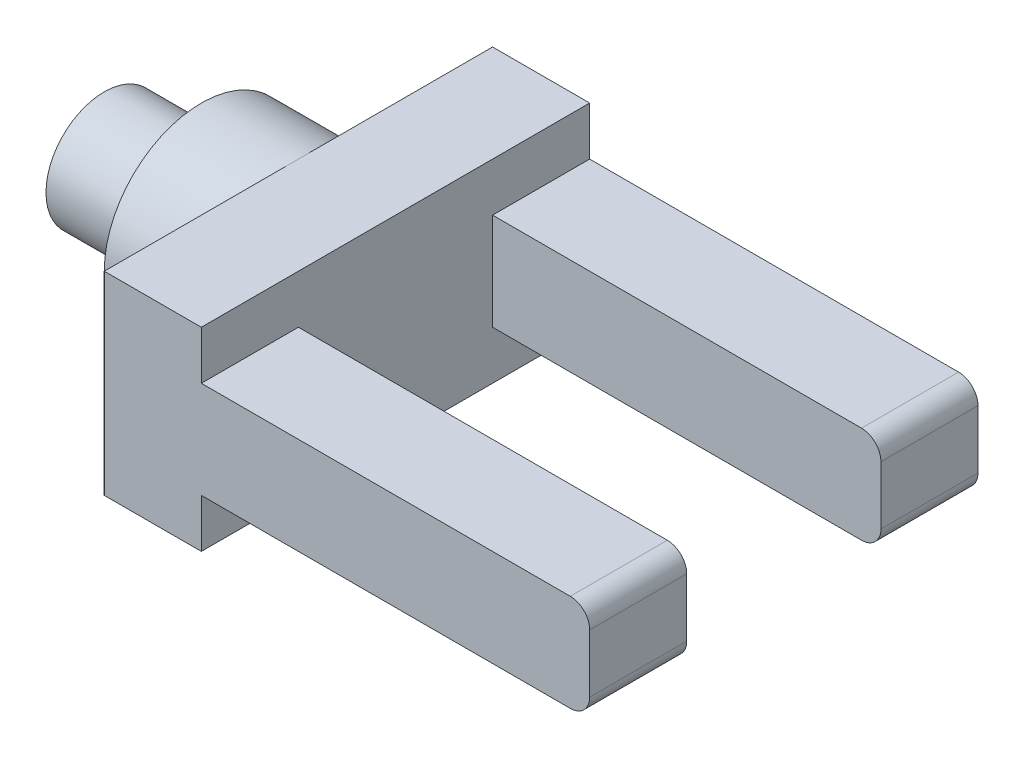
ISO-10303-21;
HEADER;
FILE_DESCRIPTION(('STEP AP214'),'2;1');
FILE_NAME('part.step','',(''),(''),'','','');
FILE_SCHEMA(('AUTOMOTIVE_DESIGN { 1 0 10303 214 1 1 1 1 }'));
ENDSEC;
DATA;
#1=APPLICATION_CONTEXT('core data for automotive mechanical design processes');
#2=APPLICATION_PROTOCOL_DEFINITION('international standard','automotive_design',2000,#1);
#3=PRODUCT_CONTEXT('',#1,'mechanical');
#4=PRODUCT('Part','Part','',(#3));
#5=PRODUCT_RELATED_PRODUCT_CATEGORY('part','',(#4));
#6=PRODUCT_DEFINITION_FORMATION('','',#4);
#7=PRODUCT_DEFINITION_CONTEXT('part definition',#1,'design');
#8=PRODUCT_DEFINITION('design','',#6,#7);
#9=PRODUCT_DEFINITION_SHAPE('','',#8);
#10=(LENGTH_UNIT() NAMED_UNIT(*) SI_UNIT(.MILLI.,.METRE.));
#11=(NAMED_UNIT(*) PLANE_ANGLE_UNIT() SI_UNIT($,.RADIAN.));
#12=(NAMED_UNIT(*) SI_UNIT($,.STERADIAN.) SOLID_ANGLE_UNIT());
#13=UNCERTAINTY_MEASURE_WITH_UNIT(LENGTH_MEASURE(1.E-05),#10,'distance_accuracy_value','');
#14=(GEOMETRIC_REPRESENTATION_CONTEXT(3) GLOBAL_UNCERTAINTY_ASSIGNED_CONTEXT((#13)) GLOBAL_UNIT_ASSIGNED_CONTEXT((#10,
#11,#12)) REPRESENTATION_CONTEXT('',''));
#15=CARTESIAN_POINT('',(0.,0.,0.));
#16=DIRECTION('',(0.,0.,1.));
#17=DIRECTION('',(1.,0.,0.));
#18=AXIS2_PLACEMENT_3D('',#15,#16,#17);
#19=CARTESIAN_POINT('',(30.,-10.,20.));
#20=DIRECTION('',(1.,0.,0.));
#21=DIRECTION('',(0.,0.,-1.));
#22=AXIS2_PLACEMENT_3D('',#19,#20,#21);
#23=PLANE('',#22);
#24=DIRECTION('',(0.,-1.,0.));
#25=VECTOR('',#24,1.);
#26=CARTESIAN_POINT('',(30.,5.,-10.));
#27=LINE('',#26,#25);
#28=CARTESIAN_POINT('',(30.,5.,-10.));
#29=VERTEX_POINT('',#28);
#30=CARTESIAN_POINT('',(30.,-5.,-10.));
#31=VERTEX_POINT('',#30);
#32=EDGE_CURVE('E178',#29,#31,#27,.T.);
#33=ORIENTED_EDGE('',*,*,#32,.F.);
#34=DIRECTION('',(0.,0.,1.));
#35=VECTOR('',#34,1.);
#36=CARTESIAN_POINT('',(30.,5.,-20.));
#37=LINE('',#36,#35);
#38=CARTESIAN_POINT('',(30.,5.,-20.));
#39=VERTEX_POINT('',#38);
#40=EDGE_CURVE('E156',#39,#29,#37,.T.);
#41=ORIENTED_EDGE('',*,*,#40,.F.);
#42=DIRECTION('',(0.,1.,0.));
#43=VECTOR('',#42,1.);
#44=CARTESIAN_POINT('',(30.,10.,-20.));
#45=LINE('',#44,#43);
#46=CARTESIAN_POINT('',(30.,10.,-20.));
#47=VERTEX_POINT('',#46);
#48=EDGE_CURVE('E165',#39,#47,#45,.T.);
#49=ORIENTED_EDGE('',*,*,#48,.T.);
#50=DIRECTION('',(0.,0.,1.));
#51=VECTOR('',#50,1.);
#52=CARTESIAN_POINT('',(30.,10.,20.));
#53=LINE('',#52,#51);
#54=CARTESIAN_POINT('',(30.,10.,20.));
#55=VERTEX_POINT('',#54);
#56=EDGE_CURVE('E288',#47,#55,#53,.T.);
#57=ORIENTED_EDGE('',*,*,#56,.T.);
#58=DIRECTION('',(0.,-1.,0.));
#59=VECTOR('',#58,1.);
#60=CARTESIAN_POINT('',(30.,10.,20.));
#61=LINE('',#60,#59);
#62=CARTESIAN_POINT('',(30.,5.,20.));
#63=VERTEX_POINT('',#62);
#64=EDGE_CURVE('E262',#55,#63,#61,.T.);
#65=ORIENTED_EDGE('',*,*,#64,.T.);
#66=DIRECTION('',(0.,0.,1.));
#67=VECTOR('',#66,1.);
#68=CARTESIAN_POINT('',(30.,5.,20.));
#69=LINE('',#68,#67);
#70=CARTESIAN_POINT('',(30.,5.,10.));
#71=VERTEX_POINT('',#70);
#72=EDGE_CURVE('E198',#71,#63,#69,.T.);
#73=ORIENTED_EDGE('',*,*,#72,.F.);
#74=DIRECTION('',(0.,1.,0.));
#75=VECTOR('',#74,1.);
#76=CARTESIAN_POINT('',(30.,5.,10.));
#77=LINE('',#76,#75);
#78=CARTESIAN_POINT('',(30.,-5.,10.));
#79=VERTEX_POINT('',#78);
#80=EDGE_CURVE('E202',#79,#71,#77,.T.);
#81=ORIENTED_EDGE('',*,*,#80,.F.);
#82=DIRECTION('',(0.,0.,-1.));
#83=VECTOR('',#82,1.);
#84=CARTESIAN_POINT('',(30.,-5.,20.));
#85=LINE('',#84,#83);
#86=CARTESIAN_POINT('',(30.,-5.,20.));
#87=VERTEX_POINT('',#86);
#88=EDGE_CURVE('E193',#87,#79,#85,.T.);
#89=ORIENTED_EDGE('',*,*,#88,.F.);
#90=CARTESIAN_POINT('',(30.,-10.,20.));
#91=VERTEX_POINT('',#90);
#92=EDGE_CURVE('E259',#87,#91,#61,.T.);
#93=ORIENTED_EDGE('',*,*,#92,.T.);
#94=DIRECTION('',(0.,0.,-1.));
#95=VECTOR('',#94,1.);
#96=CARTESIAN_POINT('',(30.,-10.,20.));
#97=LINE('',#96,#95);
#98=CARTESIAN_POINT('',(30.,-10.,-20.));
#99=VERTEX_POINT('',#98);
#100=EDGE_CURVE('E173',#91,#99,#97,.T.);
#101=ORIENTED_EDGE('',*,*,#100,.T.);
#102=CARTESIAN_POINT('',(30.,-5.,-20.));
#103=VERTEX_POINT('',#102);
#104=EDGE_CURVE('E172',#99,#103,#45,.T.);
#105=ORIENTED_EDGE('',*,*,#104,.T.);
#106=DIRECTION('',(0.,0.,-1.));
#107=VECTOR('',#106,1.);
#108=CARTESIAN_POINT('',(30.,-5.,-20.));
#109=LINE('',#108,#107);
#110=EDGE_CURVE('E180',#31,#103,#109,.T.);
#111=ORIENTED_EDGE('',*,*,#110,.F.);
#112=EDGE_LOOP('',(#33,#41,#49,#57,#65,#73,#81,#89,#93,#101,#105,#111));
#113=FACE_BOUND('',#112,.T.);
#114=ADVANCED_FACE('F32',(#113),#23,.T.);
#115=CARTESIAN_POINT('',(20.,0.,0.));
#116=DIRECTION('',(-1.,0.,0.));
#117=DIRECTION('',(0.,0.,1.));
#118=AXIS2_PLACEMENT_3D('',#115,#116,#117);
#119=CYLINDRICAL_SURFACE('',#118,10.);
#120=CARTESIAN_POINT('',(20.,0.,0.));
#121=DIRECTION('',(1.,0.,0.));
#122=DIRECTION('',(0.,0.,-1.));
#123=AXIS2_PLACEMENT_3D('',#120,#121,#122);
#124=CIRCLE('',#123,10.);
#125=CARTESIAN_POINT('',(20.,10.,0.));
#126=VERTEX_POINT('',#125);
#127=CARTESIAN_POINT('',(20.,-10.,0.));
#128=VERTEX_POINT('',#127);
#129=EDGE_CURVE('E270',#126,#128,#124,.T.);
#130=ORIENTED_EDGE('',*,*,#129,.F.);
#131=EDGE_CURVE('E268',#128,#126,#124,.T.);
#132=ORIENTED_EDGE('',*,*,#131,.F.);
#133=EDGE_LOOP('',(#130,#132));
#134=FACE_BOUND('',#133,.T.);
#135=CARTESIAN_POINT('',(10.,0.,0.));
#136=DIRECTION('',(-1.,0.,0.));
#137=DIRECTION('',(0.,0.,1.));
#138=AXIS2_PLACEMENT_3D('',#135,#136,#137);
#139=CIRCLE('',#138,10.);
#140=CARTESIAN_POINT('',(10.,0.,10.));
#141=VERTEX_POINT('',#140);
#142=EDGE_CURVE('E265',#141,#141,#139,.T.);
#143=ORIENTED_EDGE('',*,*,#142,.F.);
#144=EDGE_LOOP('',(#143));
#145=FACE_BOUND('',#144,.T.);
#146=ADVANCED_FACE('F342',(#134,#145),#119,.T.);
#147=CARTESIAN_POINT('',(10.,0.,0.));
#148=DIRECTION('',(-1.,0.,0.));
#149=DIRECTION('',(0.,0.,1.));
#150=AXIS2_PLACEMENT_3D('',#147,#148,#149);
#151=PLANE('',#150);
#152=CARTESIAN_POINT('',(10.,0.,0.));
#153=DIRECTION('',(-1.,0.,0.));
#154=DIRECTION('',(0.,0.,1.));
#155=AXIS2_PLACEMENT_3D('',#152,#153,#154);
#156=CIRCLE('',#155,6.);
#157=CARTESIAN_POINT('',(10.,0.,6.));
#158=VERTEX_POINT('',#157);
#159=EDGE_CURVE('E269',#158,#158,#156,.T.);
#160=ORIENTED_EDGE('',*,*,#159,.F.);
#161=EDGE_LOOP('',(#160));
#162=FACE_BOUND('',#161,.T.);
#163=ORIENTED_EDGE('',*,*,#142,.T.);
#164=EDGE_LOOP('',(#163));
#165=FACE_BOUND('',#164,.T.);
#166=ADVANCED_FACE('F347',(#162,#165),#151,.T.);
#167=CARTESIAN_POINT('',(10.,0.,0.));
#168=DIRECTION('',(-1.,0.,0.));
#169=DIRECTION('',(0.,0.,1.));
#170=AXIS2_PLACEMENT_3D('',#167,#168,#169);
#171=CYLINDRICAL_SURFACE('',#170,6.);
#172=ORIENTED_EDGE('',*,*,#159,.T.);
#173=EDGE_LOOP('',(#172));
#174=FACE_BOUND('',#173,.T.);
#175=CARTESIAN_POINT('',(0.,0.,0.));
#176=DIRECTION('',(-1.,0.,0.));
#177=DIRECTION('',(0.,0.,1.));
#178=AXIS2_PLACEMENT_3D('',#175,#176,#177);
#179=CIRCLE('',#178,6.);
#180=CARTESIAN_POINT('',(0.,0.,6.));
#181=VERTEX_POINT('',#180);
#182=EDGE_CURVE('E273',#181,#181,#179,.T.);
#183=ORIENTED_EDGE('',*,*,#182,.F.);
#184=EDGE_LOOP('',(#183));
#185=FACE_BOUND('',#184,.T.);
#186=ADVANCED_FACE('F372',(#174,#185),#171,.T.);
#187=CARTESIAN_POINT('',(0.,0.,0.));
#188=DIRECTION('',(1.,0.,0.));
#189=DIRECTION('',(0.,0.,-1.));
#190=AXIS2_PLACEMENT_3D('',#187,#188,#189);
#191=PLANE('',#190);
#192=ORIENTED_EDGE('',*,*,#182,.T.);
#193=EDGE_LOOP('',(#192));
#194=FACE_BOUND('',#193,.T.);
#195=ADVANCED_FACE('F358',(#194),#191,.F.);
#196=CARTESIAN_POINT('',(20.,-10.,20.));
#197=DIRECTION('',(1.,0.,0.));
#198=DIRECTION('',(0.,0.,-1.));
#199=AXIS2_PLACEMENT_3D('',#196,#197,#198);
#200=PLANE('',#199);
#201=DIRECTION('',(0.,0.,1.));
#202=VECTOR('',#201,1.);
#203=CARTESIAN_POINT('',(20.,10.,20.));
#204=LINE('',#203,#202);
#205=CARTESIAN_POINT('',(20.,10.,20.));
#206=VERTEX_POINT('',#205);
#207=EDGE_CURVE('E292',#126,#206,#204,.T.);
#208=ORIENTED_EDGE('',*,*,#207,.F.);
#209=ORIENTED_EDGE('',*,*,#129,.T.);
#210=DIRECTION('',(0.,0.,-1.));
#211=VECTOR('',#210,1.);
#212=CARTESIAN_POINT('',(20.,-10.,20.));
#213=LINE('',#212,#211);
#214=CARTESIAN_POINT('',(20.,-10.,20.));
#215=VERTEX_POINT('',#214);
#216=EDGE_CURVE('E295',#215,#128,#213,.T.);
#217=ORIENTED_EDGE('',*,*,#216,.F.);
#218=DIRECTION('',(0.,-1.,0.));
#219=VECTOR('',#218,1.);
#220=CARTESIAN_POINT('',(20.,10.,20.));
#221=LINE('',#220,#219);
#222=EDGE_CURVE('E245',#206,#215,#221,.T.);
#223=ORIENTED_EDGE('',*,*,#222,.F.);
#224=EDGE_LOOP('',(#208,#209,#217,#223));
#225=FACE_BOUND('',#224,.T.);
#226=ADVANCED_FACE('F354',(#225),#200,.F.);
#227=CARTESIAN_POINT('',(20.,-10.,-20.));
#228=VERTEX_POINT('',#227);
#229=EDGE_CURVE('E250',#128,#228,#213,.T.);
#230=ORIENTED_EDGE('',*,*,#229,.F.);
#231=ORIENTED_EDGE('',*,*,#131,.T.);
#232=CARTESIAN_POINT('',(20.,10.,-20.));
#233=VERTEX_POINT('',#232);
#234=EDGE_CURVE('E289',#233,#126,#204,.T.);
#235=ORIENTED_EDGE('',*,*,#234,.F.);
#236=DIRECTION('',(0.,1.,0.));
#237=VECTOR('',#236,1.);
#238=CARTESIAN_POINT('',(20.,10.,-20.));
#239=LINE('',#238,#237);
#240=EDGE_CURVE('E293',#228,#233,#239,.T.);
#241=ORIENTED_EDGE('',*,*,#240,.F.);
#242=EDGE_LOOP('',(#230,#231,#235,#241));
#243=FACE_BOUND('',#242,.T.);
#244=ADVANCED_FACE('F357',(#243),#200,.F.);
#245=CARTESIAN_POINT('',(30.,10.,20.));
#246=DIRECTION('',(0.,0.,-1.));
#247=DIRECTION('',(0.,1.,0.));
#248=AXIS2_PLACEMENT_3D('',#245,#246,#247);
#249=PLANE('',#248);
#250=DIRECTION('',(-1.,0.,0.));
#251=VECTOR('',#250,1.);
#252=CARTESIAN_POINT('',(70.,-5.,20.));
#253=LINE('',#252,#251);
#254=CARTESIAN_POINT('',(68.,-5.,20.));
#255=VERTEX_POINT('',#254);
#256=EDGE_CURVE('E226',#255,#87,#253,.T.);
#257=ORIENTED_EDGE('',*,*,#256,.F.);
#258=CARTESIAN_POINT('',(68.,-3.,20.));
#259=DIRECTION('',(0.,0.,-1.));
#260=DIRECTION('',(0.,1.,0.));
#261=AXIS2_PLACEMENT_3D('',#258,#259,#260);
#262=CIRCLE('',#261,2.);
#263=CARTESIAN_POINT('',(70.,-3.,20.));
#264=VERTEX_POINT('',#263);
#265=EDGE_CURVE('E40',#255,#264,#262,.F.);
#266=ORIENTED_EDGE('',*,*,#265,.T.);
#267=DIRECTION('',(0.,-1.,0.));
#268=VECTOR('',#267,1.);
#269=CARTESIAN_POINT('',(70.,5.,20.));
#270=LINE('',#269,#268);
#271=CARTESIAN_POINT('',(70.,3.,20.));
#272=VERTEX_POINT('',#271);
#273=EDGE_CURVE('E194',#272,#264,#270,.T.);
#274=ORIENTED_EDGE('',*,*,#273,.F.);
#275=CARTESIAN_POINT('',(68.,3.,20.));
#276=DIRECTION('',(0.,0.,-1.));
#277=DIRECTION('',(0.,1.,0.));
#278=AXIS2_PLACEMENT_3D('',#275,#276,#277);
#279=CIRCLE('',#278,2.);
#280=CARTESIAN_POINT('',(68.,5.,20.));
#281=VERTEX_POINT('',#280);
#282=EDGE_CURVE('E47',#272,#281,#279,.F.);
#283=ORIENTED_EDGE('',*,*,#282,.T.);
#284=DIRECTION('',(-1.,0.,0.));
#285=VECTOR('',#284,1.);
#286=CARTESIAN_POINT('',(70.,5.,20.));
#287=LINE('',#286,#285);
#288=EDGE_CURVE('E201',#281,#63,#287,.T.);
#289=ORIENTED_EDGE('',*,*,#288,.T.);
#290=ORIENTED_EDGE('',*,*,#64,.F.);
#291=DIRECTION('',(-1.,0.,0.));
#292=VECTOR('',#291,1.);
#293=CARTESIAN_POINT('',(30.,10.,20.));
#294=LINE('',#293,#292);
#295=EDGE_CURVE('E285',#55,#206,#294,.T.);
#296=ORIENTED_EDGE('',*,*,#295,.T.);
#297=ORIENTED_EDGE('',*,*,#222,.T.);
#298=DIRECTION('',(-1.,0.,0.));
#299=VECTOR('',#298,1.);
#300=CARTESIAN_POINT('',(30.,-10.,20.));
#301=LINE('',#300,#299);
#302=EDGE_CURVE('E276',#91,#215,#301,.T.);
#303=ORIENTED_EDGE('',*,*,#302,.F.);
#304=ORIENTED_EDGE('',*,*,#92,.F.);
#305=EDGE_LOOP('',(#257,#266,#274,#283,#289,#290,#296,#297,#303,#304));
#306=FACE_BOUND('',#305,.T.);
#307=ADVANCED_FACE('F224',(#306),#249,.F.);
#308=CARTESIAN_POINT('',(30.,-10.,20.));
#309=DIRECTION('',(0.,1.,0.));
#310=DIRECTION('',(0.,0.,1.));
#311=AXIS2_PLACEMENT_3D('',#308,#309,#310);
#312=PLANE('',#311);
#313=ORIENTED_EDGE('',*,*,#216,.T.);
#314=ORIENTED_EDGE('',*,*,#229,.T.);
#315=DIRECTION('',(-1.,0.,0.));
#316=VECTOR('',#315,1.);
#317=CARTESIAN_POINT('',(30.,-10.,-20.));
#318=LINE('',#317,#316);
#319=EDGE_CURVE('E281',#99,#228,#318,.T.);
#320=ORIENTED_EDGE('',*,*,#319,.F.);
#321=ORIENTED_EDGE('',*,*,#100,.F.);
#322=ORIENTED_EDGE('',*,*,#302,.T.);
#323=EDGE_LOOP('',(#313,#314,#320,#321,#322));
#324=FACE_BOUND('',#323,.T.);
#325=ADVANCED_FACE('F366',(#324),#312,.F.);
#326=CARTESIAN_POINT('',(30.,10.,-20.));
#327=DIRECTION('',(0.,0.,1.));
#328=DIRECTION('',(0.,-1.,0.));
#329=AXIS2_PLACEMENT_3D('',#326,#327,#328);
#330=PLANE('',#329);
#331=DIRECTION('',(0.,1.,0.));
#332=VECTOR('',#331,1.);
#333=CARTESIAN_POINT('',(70.,5.,-20.));
#334=LINE('',#333,#332);
#335=CARTESIAN_POINT('',(70.,-3.,-20.));
#336=VERTEX_POINT('',#335);
#337=CARTESIAN_POINT('',(70.,3.,-20.));
#338=VERTEX_POINT('',#337);
#339=EDGE_CURVE('E162',#336,#338,#334,.T.);
#340=ORIENTED_EDGE('',*,*,#339,.F.);
#341=CARTESIAN_POINT('',(68.,-3.,-20.));
#342=DIRECTION('',(0.,0.,1.));
#343=DIRECTION('',(0.,-1.,0.));
#344=AXIS2_PLACEMENT_3D('',#341,#342,#343);
#345=CIRCLE('',#344,2.);
#346=CARTESIAN_POINT('',(68.,-5.,-20.));
#347=VERTEX_POINT('',#346);
#348=EDGE_CURVE('E324',#336,#347,#345,.F.);
#349=ORIENTED_EDGE('',*,*,#348,.T.);
#350=DIRECTION('',(-1.,0.,0.));
#351=VECTOR('',#350,1.);
#352=CARTESIAN_POINT('',(70.,-5.,-20.));
#353=LINE('',#352,#351);
#354=EDGE_CURVE('E161',#347,#103,#353,.T.);
#355=ORIENTED_EDGE('',*,*,#354,.T.);
#356=ORIENTED_EDGE('',*,*,#104,.F.);
#357=ORIENTED_EDGE('',*,*,#319,.T.);
#358=ORIENTED_EDGE('',*,*,#240,.T.);
#359=DIRECTION('',(-1.,0.,0.));
#360=VECTOR('',#359,1.);
#361=CARTESIAN_POINT('',(30.,10.,-20.));
#362=LINE('',#361,#360);
#363=EDGE_CURVE('E169',#47,#233,#362,.T.);
#364=ORIENTED_EDGE('',*,*,#363,.F.);
#365=ORIENTED_EDGE('',*,*,#48,.F.);
#366=DIRECTION('',(-1.,0.,0.));
#367=VECTOR('',#366,1.);
#368=CARTESIAN_POINT('',(70.,5.,-20.));
#369=LINE('',#368,#367);
#370=CARTESIAN_POINT('',(68.,5.,-20.));
#371=VERTEX_POINT('',#370);
#372=EDGE_CURVE('E151',#371,#39,#369,.T.);
#373=ORIENTED_EDGE('',*,*,#372,.F.);
#374=CARTESIAN_POINT('',(68.,3.,-20.));
#375=DIRECTION('',(0.,0.,1.));
#376=DIRECTION('',(0.,-1.,0.));
#377=AXIS2_PLACEMENT_3D('',#374,#375,#376);
#378=CIRCLE('',#377,2.);
#379=EDGE_CURVE('E326',#371,#338,#378,.F.);
#380=ORIENTED_EDGE('',*,*,#379,.T.);
#381=EDGE_LOOP('',(#340,#349,#355,#356,#357,#358,#364,#365,#373,#380));
#382=FACE_BOUND('',#381,.T.);
#383=ADVANCED_FACE('F167',(#382),#330,.F.);
#384=CARTESIAN_POINT('',(30.,10.,20.));
#385=DIRECTION('',(0.,-1.,0.));
#386=DIRECTION('',(0.,0.,-1.));
#387=AXIS2_PLACEMENT_3D('',#384,#385,#386);
#388=PLANE('',#387);
#389=ORIENTED_EDGE('',*,*,#234,.T.);
#390=ORIENTED_EDGE('',*,*,#207,.T.);
#391=ORIENTED_EDGE('',*,*,#295,.F.);
#392=ORIENTED_EDGE('',*,*,#56,.F.);
#393=ORIENTED_EDGE('',*,*,#363,.T.);
#394=EDGE_LOOP('',(#389,#390,#391,#392,#393));
#395=FACE_BOUND('',#394,.T.);
#396=ADVANCED_FACE('F360',(#395),#388,.F.);
#397=CARTESIAN_POINT('',(70.,-5.,20.));
#398=DIRECTION('',(0.,1.,0.));
#399=DIRECTION('',(0.,0.,1.));
#400=AXIS2_PLACEMENT_3D('',#397,#398,#399);
#401=PLANE('',#400);
#402=DIRECTION('',(-1.,0.,0.));
#403=VECTOR('',#402,1.);
#404=CARTESIAN_POINT('',(70.,-5.,10.));
#405=LINE('',#404,#403);
#406=CARTESIAN_POINT('',(68.,-5.,10.));
#407=VERTEX_POINT('',#406);
#408=EDGE_CURVE('E246',#407,#79,#405,.T.);
#409=ORIENTED_EDGE('',*,*,#408,.F.);
#410=DIRECTION('',(0.,0.,-1.));
#411=VECTOR('',#410,1.);
#412=CARTESIAN_POINT('',(68.,-5.,20.));
#413=LINE('',#412,#411);
#414=EDGE_CURVE('E55',#407,#255,#413,.F.);
#415=ORIENTED_EDGE('',*,*,#414,.T.);
#416=ORIENTED_EDGE('',*,*,#256,.T.);
#417=ORIENTED_EDGE('',*,*,#88,.T.);
#418=EDGE_LOOP('',(#409,#415,#416,#417));
#419=FACE_BOUND('',#418,.T.);
#420=ADVANCED_FACE('F352',(#419),#401,.F.);
#421=CARTESIAN_POINT('',(70.,5.,10.));
#422=DIRECTION('',(0.,0.,1.));
#423=DIRECTION('',(0.,-1.,0.));
#424=AXIS2_PLACEMENT_3D('',#421,#422,#423);
#425=PLANE('',#424);
#426=DIRECTION('',(0.,1.,0.));
#427=VECTOR('',#426,1.);
#428=CARTESIAN_POINT('',(70.,5.,10.));
#429=LINE('',#428,#427);
#430=CARTESIAN_POINT('',(70.,-3.,10.));
#431=VERTEX_POINT('',#430);
#432=CARTESIAN_POINT('',(70.,3.,10.));
#433=VERTEX_POINT('',#432);
#434=EDGE_CURVE('E197',#431,#433,#429,.T.);
#435=ORIENTED_EDGE('',*,*,#434,.F.);
#436=CARTESIAN_POINT('',(68.,-3.,10.));
#437=DIRECTION('',(0.,0.,1.));
#438=DIRECTION('',(0.,-1.,0.));
#439=AXIS2_PLACEMENT_3D('',#436,#437,#438);
#440=CIRCLE('',#439,2.);
#441=EDGE_CURVE('E238',#431,#407,#440,.F.);
#442=ORIENTED_EDGE('',*,*,#441,.T.);
#443=ORIENTED_EDGE('',*,*,#408,.T.);
#444=ORIENTED_EDGE('',*,*,#80,.T.);
#445=DIRECTION('',(-1.,0.,0.));
#446=VECTOR('',#445,1.);
#447=CARTESIAN_POINT('',(70.,5.,10.));
#448=LINE('',#447,#446);
#449=CARTESIAN_POINT('',(68.,5.,10.));
#450=VERTEX_POINT('',#449);
#451=EDGE_CURVE('E207',#450,#71,#448,.T.);
#452=ORIENTED_EDGE('',*,*,#451,.F.);
#453=CARTESIAN_POINT('',(68.,3.,10.));
#454=DIRECTION('',(0.,0.,1.));
#455=DIRECTION('',(0.,-1.,0.));
#456=AXIS2_PLACEMENT_3D('',#453,#454,#455);
#457=CIRCLE('',#456,2.);
#458=EDGE_CURVE('E239',#450,#433,#457,.F.);
#459=ORIENTED_EDGE('',*,*,#458,.T.);
#460=EDGE_LOOP('',(#435,#442,#443,#444,#452,#459));
#461=FACE_BOUND('',#460,.T.);
#462=ADVANCED_FACE('F420',(#461),#425,.F.);
#463=CARTESIAN_POINT('',(70.,5.,20.));
#464=DIRECTION('',(0.,-1.,0.));
#465=DIRECTION('',(0.,0.,-1.));
#466=AXIS2_PLACEMENT_3D('',#463,#464,#465);
#467=PLANE('',#466);
#468=ORIENTED_EDGE('',*,*,#288,.F.);
#469=DIRECTION('',(0.,0.,1.));
#470=VECTOR('',#469,1.);
#471=CARTESIAN_POINT('',(68.,5.,10.));
#472=LINE('',#471,#470);
#473=EDGE_CURVE('E12',#281,#450,#472,.F.);
#474=ORIENTED_EDGE('',*,*,#473,.T.);
#475=ORIENTED_EDGE('',*,*,#451,.T.);
#476=ORIENTED_EDGE('',*,*,#72,.T.);
#477=EDGE_LOOP('',(#468,#474,#475,#476));
#478=FACE_BOUND('',#477,.T.);
#479=ADVANCED_FACE('F426',(#478),#467,.F.);
#480=CARTESIAN_POINT('',(70.,-5.,20.));
#481=DIRECTION('',(1.,0.,0.));
#482=DIRECTION('',(0.,0.,-1.));
#483=AXIS2_PLACEMENT_3D('',#480,#481,#482);
#484=PLANE('',#483);
#485=ORIENTED_EDGE('',*,*,#273,.T.);
#486=DIRECTION('',(0.,0.,-1.));
#487=VECTOR('',#486,1.);
#488=CARTESIAN_POINT('',(70.,-3.,10.));
#489=LINE('',#488,#487);
#490=EDGE_CURVE('E233',#264,#431,#489,.T.);
#491=ORIENTED_EDGE('',*,*,#490,.T.);
#492=ORIENTED_EDGE('',*,*,#434,.T.);
#493=DIRECTION('',(0.,0.,1.));
#494=VECTOR('',#493,1.);
#495=CARTESIAN_POINT('',(70.,3.,20.));
#496=LINE('',#495,#494);
#497=EDGE_CURVE('E236',#433,#272,#496,.T.);
#498=ORIENTED_EDGE('',*,*,#497,.T.);
#499=EDGE_LOOP('',(#485,#491,#492,#498));
#500=FACE_BOUND('',#499,.T.);
#501=ADVANCED_FACE('F232',(#500),#484,.T.);
#502=CARTESIAN_POINT('',(70.,5.,-20.));
#503=DIRECTION('',(0.,-1.,0.));
#504=DIRECTION('',(0.,0.,-1.));
#505=AXIS2_PLACEMENT_3D('',#502,#503,#504);
#506=PLANE('',#505);
#507=DIRECTION('',(-1.,0.,0.));
#508=VECTOR('',#507,1.);
#509=CARTESIAN_POINT('',(70.,5.,-10.));
#510=LINE('',#509,#508);
#511=CARTESIAN_POINT('',(68.,5.,-10.));
#512=VERTEX_POINT('',#511);
#513=EDGE_CURVE('E191',#512,#29,#510,.T.);
#514=ORIENTED_EDGE('',*,*,#513,.F.);
#515=DIRECTION('',(0.,0.,1.));
#516=VECTOR('',#515,1.);
#517=CARTESIAN_POINT('',(68.,5.,-20.));
#518=LINE('',#517,#516);
#519=EDGE_CURVE('E158',#512,#371,#518,.F.);
#520=ORIENTED_EDGE('',*,*,#519,.T.);
#521=ORIENTED_EDGE('',*,*,#372,.T.);
#522=ORIENTED_EDGE('',*,*,#40,.T.);
#523=EDGE_LOOP('',(#514,#520,#521,#522));
#524=FACE_BOUND('',#523,.T.);
#525=ADVANCED_FACE('F154',(#524),#506,.F.);
#526=CARTESIAN_POINT('',(70.,5.,-10.));
#527=DIRECTION('',(0.,0.,-1.));
#528=DIRECTION('',(0.,1.,0.));
#529=AXIS2_PLACEMENT_3D('',#526,#527,#528);
#530=PLANE('',#529);
#531=DIRECTION('',(-1.,0.,0.));
#532=VECTOR('',#531,1.);
#533=CARTESIAN_POINT('',(70.,-5.,-10.));
#534=LINE('',#533,#532);
#535=CARTESIAN_POINT('',(68.,-5.,-10.));
#536=VERTEX_POINT('',#535);
#537=EDGE_CURVE('E189',#536,#31,#534,.T.);
#538=ORIENTED_EDGE('',*,*,#537,.F.);
#539=CARTESIAN_POINT('',(68.,-3.,-10.));
#540=DIRECTION('',(0.,0.,-1.));
#541=DIRECTION('',(0.,1.,0.));
#542=AXIS2_PLACEMENT_3D('',#539,#540,#541);
#543=CIRCLE('',#542,2.);
#544=CARTESIAN_POINT('',(70.,-3.,-10.));
#545=VERTEX_POINT('',#544);
#546=EDGE_CURVE('E312',#536,#545,#543,.F.);
#547=ORIENTED_EDGE('',*,*,#546,.T.);
#548=DIRECTION('',(0.,-1.,0.));
#549=VECTOR('',#548,1.);
#550=CARTESIAN_POINT('',(70.,5.,-10.));
#551=LINE('',#550,#549);
#552=CARTESIAN_POINT('',(70.,3.,-10.));
#553=VERTEX_POINT('',#552);
#554=EDGE_CURVE('E186',#553,#545,#551,.T.);
#555=ORIENTED_EDGE('',*,*,#554,.F.);
#556=CARTESIAN_POINT('',(68.,3.,-10.));
#557=DIRECTION('',(0.,0.,-1.));
#558=DIRECTION('',(0.,1.,0.));
#559=AXIS2_PLACEMENT_3D('',#556,#557,#558);
#560=CIRCLE('',#559,2.);
#561=EDGE_CURVE('E319',#553,#512,#560,.F.);
#562=ORIENTED_EDGE('',*,*,#561,.T.);
#563=ORIENTED_EDGE('',*,*,#513,.T.);
#564=ORIENTED_EDGE('',*,*,#32,.T.);
#565=EDGE_LOOP('',(#538,#547,#555,#562,#563,#564));
#566=FACE_BOUND('',#565,.T.);
#567=ADVANCED_FACE('F310',(#566),#530,.F.);
#568=CARTESIAN_POINT('',(70.,-5.,-20.));
#569=DIRECTION('',(0.,1.,0.));
#570=DIRECTION('',(0.,0.,1.));
#571=AXIS2_PLACEMENT_3D('',#568,#569,#570);
#572=PLANE('',#571);
#573=ORIENTED_EDGE('',*,*,#354,.F.);
#574=DIRECTION('',(0.,0.,-1.));
#575=VECTOR('',#574,1.);
#576=CARTESIAN_POINT('',(68.,-5.,-10.));
#577=LINE('',#576,#575);
#578=EDGE_CURVE('E307',#347,#536,#577,.F.);
#579=ORIENTED_EDGE('',*,*,#578,.T.);
#580=ORIENTED_EDGE('',*,*,#537,.T.);
#581=ORIENTED_EDGE('',*,*,#110,.T.);
#582=EDGE_LOOP('',(#573,#579,#580,#581));
#583=FACE_BOUND('',#582,.T.);
#584=ADVANCED_FACE('F304',(#583),#572,.F.);
#585=CARTESIAN_POINT('',(70.,5.,-10.));
#586=DIRECTION('',(1.,0.,0.));
#587=DIRECTION('',(0.,0.,-1.));
#588=AXIS2_PLACEMENT_3D('',#585,#586,#587);
#589=PLANE('',#588);
#590=ORIENTED_EDGE('',*,*,#554,.T.);
#591=DIRECTION('',(0.,0.,-1.));
#592=VECTOR('',#591,1.);
#593=CARTESIAN_POINT('',(70.,-3.,-20.));
#594=LINE('',#593,#592);
#595=EDGE_CURVE('E318',#545,#336,#594,.T.);
#596=ORIENTED_EDGE('',*,*,#595,.T.);
#597=ORIENTED_EDGE('',*,*,#339,.T.);
#598=DIRECTION('',(0.,0.,1.));
#599=VECTOR('',#598,1.);
#600=CARTESIAN_POINT('',(70.,3.,-10.));
#601=LINE('',#600,#599);
#602=EDGE_CURVE('E217',#338,#553,#601,.T.);
#603=ORIENTED_EDGE('',*,*,#602,.T.);
#604=EDGE_LOOP('',(#590,#596,#597,#603));
#605=FACE_BOUND('',#604,.T.);
#606=ADVANCED_FACE('F331',(#605),#589,.T.);
#607=CARTESIAN_POINT('',(68.,-3.,-10.));
#608=DIRECTION('',(0.,0.,1.));
#609=DIRECTION('',(1.,0.,0.));
#610=AXIS2_PLACEMENT_3D('',#607,#608,#609);
#611=CYLINDRICAL_SURFACE('',#610,2.);
#612=ORIENTED_EDGE('',*,*,#546,.F.);
#613=ORIENTED_EDGE('',*,*,#578,.F.);
#614=ORIENTED_EDGE('',*,*,#348,.F.);
#615=ORIENTED_EDGE('',*,*,#595,.F.);
#616=EDGE_LOOP('',(#612,#613,#614,#615));
#617=FACE_BOUND('',#616,.T.);
#618=ADVANCED_FACE('F316',(#617),#611,.T.);
#619=CARTESIAN_POINT('',(68.,3.,-10.));
#620=DIRECTION('',(0.,0.,-1.));
#621=DIRECTION('',(0.,1.,0.));
#622=AXIS2_PLACEMENT_3D('',#619,#620,#621);
#623=CYLINDRICAL_SURFACE('',#622,2.);
#624=ORIENTED_EDGE('',*,*,#379,.F.);
#625=ORIENTED_EDGE('',*,*,#519,.F.);
#626=ORIENTED_EDGE('',*,*,#561,.F.);
#627=ORIENTED_EDGE('',*,*,#602,.F.);
#628=EDGE_LOOP('',(#624,#625,#626,#627));
#629=FACE_BOUND('',#628,.T.);
#630=ADVANCED_FACE('F333',(#629),#623,.T.);
#631=CARTESIAN_POINT('',(68.,-3.,20.));
#632=DIRECTION('',(0.,0.,1.));
#633=DIRECTION('',(1.,0.,0.));
#634=AXIS2_PLACEMENT_3D('',#631,#632,#633);
#635=CYLINDRICAL_SURFACE('',#634,2.);
#636=ORIENTED_EDGE('',*,*,#265,.F.);
#637=ORIENTED_EDGE('',*,*,#414,.F.);
#638=ORIENTED_EDGE('',*,*,#441,.F.);
#639=ORIENTED_EDGE('',*,*,#490,.F.);
#640=EDGE_LOOP('',(#636,#637,#638,#639));
#641=FACE_BOUND('',#640,.T.);
#642=ADVANCED_FACE('F237',(#641),#635,.T.);
#643=CARTESIAN_POINT('',(68.,3.,20.));
#644=DIRECTION('',(0.,0.,-1.));
#645=DIRECTION('',(0.,1.,0.));
#646=AXIS2_PLACEMENT_3D('',#643,#644,#645);
#647=CYLINDRICAL_SURFACE('',#646,2.);
#648=ORIENTED_EDGE('',*,*,#458,.F.);
#649=ORIENTED_EDGE('',*,*,#473,.F.);
#650=ORIENTED_EDGE('',*,*,#282,.F.);
#651=ORIENTED_EDGE('',*,*,#497,.F.);
#652=EDGE_LOOP('',(#648,#649,#650,#651));
#653=FACE_BOUND('',#652,.T.);
#654=ADVANCED_FACE('F34',(#653),#647,.T.);
#655=CLOSED_SHELL('',(#114,#146,#166,#186,#195,#226,#244,#307,#325,#383,#396,#420,#462,#479,
#501,#525,#567,#584,#606,#618,#630,#642,#654));
#656=MANIFOLD_SOLID_BREP('B2',#655);
#657=ADVANCED_BREP_SHAPE_REPRESENTATION('',(#18,#656),#14);
#658=SHAPE_DEFINITION_REPRESENTATION(#9,#657);
ENDSEC;
END-ISO-10303-21;
